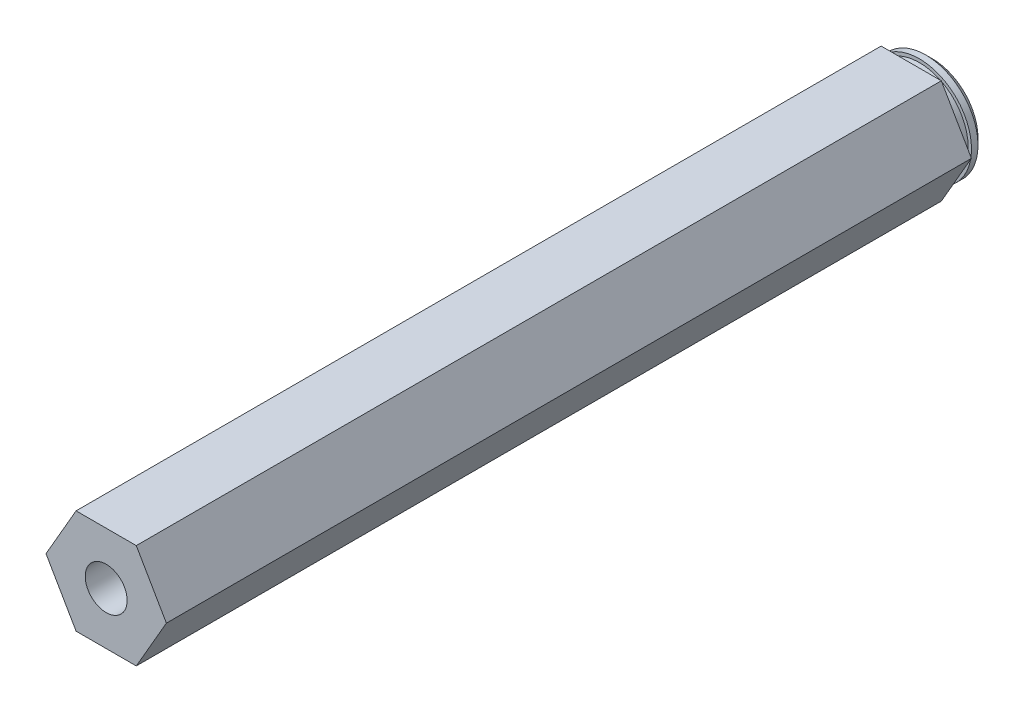
ISO-10303-21;
HEADER;
FILE_DESCRIPTION(('STEP AP214'),'2;1');
FILE_NAME('part.step','',(''),(''),'','','');
FILE_SCHEMA(('AUTOMOTIVE_DESIGN { 1 0 10303 214 1 1 1 1 }'));
ENDSEC;
DATA;
#1=APPLICATION_CONTEXT('core data for automotive mechanical design processes');
#2=APPLICATION_PROTOCOL_DEFINITION('international standard','automotive_design',2000,#1);
#3=PRODUCT_CONTEXT('',#1,'mechanical');
#4=PRODUCT('Part','Part','',(#3));
#5=PRODUCT_RELATED_PRODUCT_CATEGORY('part','',(#4));
#6=PRODUCT_DEFINITION_FORMATION('','',#4);
#7=PRODUCT_DEFINITION_CONTEXT('part definition',#1,'design');
#8=PRODUCT_DEFINITION('design','',#6,#7);
#9=PRODUCT_DEFINITION_SHAPE('','',#8);
#10=(LENGTH_UNIT() NAMED_UNIT(*) SI_UNIT(.MILLI.,.METRE.));
#11=(NAMED_UNIT(*) PLANE_ANGLE_UNIT() SI_UNIT($,.RADIAN.));
#12=(NAMED_UNIT(*) SI_UNIT($,.STERADIAN.) SOLID_ANGLE_UNIT());
#13=UNCERTAINTY_MEASURE_WITH_UNIT(LENGTH_MEASURE(1.E-05),#10,'distance_accuracy_value','');
#14=(GEOMETRIC_REPRESENTATION_CONTEXT(3) GLOBAL_UNCERTAINTY_ASSIGNED_CONTEXT((#13)) GLOBAL_UNIT_ASSIGNED_CONTEXT((#10,
#11,#12)) REPRESENTATION_CONTEXT('',''));
#15=CARTESIAN_POINT('',(0.,0.,0.));
#16=DIRECTION('',(0.,0.,1.));
#17=DIRECTION('',(1.,0.,0.));
#18=AXIS2_PLACEMENT_3D('',#15,#16,#17);
#19=CARTESIAN_POINT('',(0.,0.,-38.0999999999858));
#20=DIRECTION('',(0.,0.,-1.));
#21=DIRECTION('',(-1.,0.,0.));
#22=AXIS2_PLACEMENT_3D('',#19,#20,#21);
#23=CONICAL_SURFACE('',#22,3.1877000000122,1.02974425867476);
#24=CARTESIAN_POINT('',(0.,0.,-36.1846366047303));
#25=VERTEX_POINT('',#24);
#26=VERTEX_LOOP('',#25);
#27=FACE_BOUND('',#26,.T.);
#28=CARTESIAN_POINT('',(0.,0.,-38.0999999999997));
#29=DIRECTION('',(0.,0.,-1.));
#30=DIRECTION('',(-1.,0.,0.));
#31=AXIS2_PLACEMENT_3D('',#28,#29,#30);
#32=CIRCLE('',#31,3.1877);
#33=CARTESIAN_POINT('',(-3.18770000000004,0.,-38.0999999999997));
#34=VERTEX_POINT('',#33);
#35=EDGE_CURVE('E77',#34,#34,#32,.T.);
#36=ORIENTED_EDGE('',*,*,#35,.T.);
#37=EDGE_LOOP('',(#36));
#38=FACE_BOUND('',#37,.T.);
#39=ADVANCED_FACE('F17',(#27,#38),#23,.F.);
#40=CARTESIAN_POINT('',(0.,0.,-63.4999999999997));
#41=DIRECTION('',(0.,0.,-1.));
#42=DIRECTION('',(-1.,0.,0.));
#43=AXIS2_PLACEMENT_3D('',#40,#41,#42);
#44=CYLINDRICAL_SURFACE('',#43,3.1877);
#45=ORIENTED_EDGE('',*,*,#35,.F.);
#46=EDGE_LOOP('',(#45));
#47=FACE_BOUND('',#46,.T.);
#48=CARTESIAN_POINT('',(0.,0.,-63.4999999999997));
#49=DIRECTION('',(0.,0.,-1.));
#50=DIRECTION('',(-1.,0.,0.));
#51=AXIS2_PLACEMENT_3D('',#48,#49,#50);
#52=CIRCLE('',#51,3.1877);
#53=CARTESIAN_POINT('',(-3.18770000000004,0.,-63.4999999999997));
#54=VERTEX_POINT('',#53);
#55=EDGE_CURVE('E20',#54,#54,#52,.T.);
#56=ORIENTED_EDGE('',*,*,#55,.T.);
#57=EDGE_LOOP('',(#56));
#58=FACE_BOUND('',#57,.T.);
#59=ADVANCED_FACE('F74',(#47,#58),#44,.F.);
#60=CARTESIAN_POINT('',(0.,0.,-63.4999999999997));
#61=DIRECTION('',(0.,0.,1.));
#62=DIRECTION('',(1.,0.,0.));
#63=AXIS2_PLACEMENT_3D('',#60,#61,#62);
#64=PLANE('',#63);
#65=ORIENTED_EDGE('',*,*,#55,.F.);
#66=EDGE_LOOP('',(#65));
#67=FACE_BOUND('',#66,.T.);
#68=CARTESIAN_POINT('',(-1.11022302462516E-13,0.,-63.5000000000332));
#69=DIRECTION('',(0.,0.,1.));
#70=DIRECTION('',(1.,0.,0.));
#71=AXIS2_PLACEMENT_3D('',#68,#69,#70);
#72=CIRCLE('',#71,5.55624999998383);
#73=CARTESIAN_POINT('',(5.55624999998372,0.,-63.5000000000332));
#74=VERTEX_POINT('',#73);
#75=EDGE_CURVE('E81',#74,#74,#72,.T.);
#76=ORIENTED_EDGE('',*,*,#75,.F.);
#77=EDGE_LOOP('',(#76));
#78=FACE_BOUND('',#77,.T.);
#79=ADVANCED_FACE('F113',(#67,#78),#64,.F.);
#80=CARTESIAN_POINT('',(-1.11022302462516E-13,0.,-62.7062500000193));
#81=DIRECTION('',(0.,0.,1.));
#82=DIRECTION('',(1.,0.,0.));
#83=AXIS2_PLACEMENT_3D('',#80,#81,#82);
#84=CONICAL_SURFACE('',#83,6.34999999999775,0.785398163397448);
#85=CARTESIAN_POINT('',(0.,0.,-62.7062499999997));
#86=DIRECTION('',(0.,0.,-1.));
#87=DIRECTION('',(-1.,0.,0.));
#88=AXIS2_PLACEMENT_3D('',#85,#86,#87);
#89=CIRCLE('',#88,6.35000000000001);
#90=CARTESIAN_POINT('',(-6.35,0.,-62.7062499999997));
#91=VERTEX_POINT('',#90);
#92=EDGE_CURVE('E84',#91,#91,#89,.F.);
#93=ORIENTED_EDGE('',*,*,#92,.F.);
#94=EDGE_LOOP('',(#93));
#95=FACE_BOUND('',#94,.T.);
#96=ORIENTED_EDGE('',*,*,#75,.T.);
#97=EDGE_LOOP('',(#96));
#98=FACE_BOUND('',#97,.T.);
#99=ADVANCED_FACE('F111',(#95,#98),#84,.T.);
#100=CARTESIAN_POINT('',(0.,0.,-60.9218999999998));
#101=DIRECTION('',(0.,0.,-1.));
#102=DIRECTION('',(-1.,0.,0.));
#103=AXIS2_PLACEMENT_3D('',#100,#101,#102);
#104=CYLINDRICAL_SURFACE('',#103,6.35000000000001);
#105=ORIENTED_EDGE('',*,*,#92,.T.);
#106=EDGE_LOOP('',(#105));
#107=FACE_BOUND('',#106,.T.);
#108=CARTESIAN_POINT('',(0.,0.,-61.9124999999996));
#109=DIRECTION('',(0.,0.,-1.));
#110=DIRECTION('',(-1.,0.,0.));
#111=AXIS2_PLACEMENT_3D('',#108,#109,#110);
#112=CIRCLE('',#111,6.35000000000001);
#113=CARTESIAN_POINT('',(-6.35,0.,-61.9124999999996));
#114=VERTEX_POINT('',#113);
#115=EDGE_CURVE('E100',#114,#114,#112,.F.);
#116=ORIENTED_EDGE('',*,*,#115,.F.);
#117=EDGE_LOOP('',(#116));
#118=FACE_BOUND('',#117,.T.);
#119=ADVANCED_FACE('F108',(#107,#118),#104,.T.);
#120=CARTESIAN_POINT('',(0.,6.34999999999994,-61.9124999999997));
#121=DIRECTION('',(0.,0.,1.));
#122=DIRECTION('',(1.,0.,0.));
#123=AXIS2_PLACEMENT_3D('',#120,#121,#122);
#124=PLANE('',#123);
#125=CARTESIAN_POINT('',(0.,0.,-61.9124999999996));
#126=DIRECTION('',(0.,0.,1.));
#127=DIRECTION('',(1.,0.,0.));
#128=AXIS2_PLACEMENT_3D('',#125,#126,#127);
#129=CIRCLE('',#128,5.94360000000001);
#130=CARTESIAN_POINT('',(5.94360000000001,0.,-61.9124999999996));
#131=VERTEX_POINT('',#130);
#132=EDGE_CURVE('E96',#131,#131,#129,.T.);
#133=ORIENTED_EDGE('',*,*,#132,.F.);
#134=EDGE_LOOP('',(#133));
#135=FACE_BOUND('',#134,.T.);
#136=ORIENTED_EDGE('',*,*,#115,.T.);
#137=EDGE_LOOP('',(#136));
#138=FACE_BOUND('',#137,.T.);
#139=ADVANCED_FACE('F120',(#135,#138),#124,.T.);
#140=CARTESIAN_POINT('',(0.,0.,-5.68432771574923E-11));
#141=DIRECTION('',(0.,0.,1.));
#142=DIRECTION('',(1.,0.,0.));
#143=AXIS2_PLACEMENT_3D('',#140,#141,#142);
#144=CONICAL_SURFACE('',#143,2.55270000002383,1.02974425868774);
#145=CARTESIAN_POINT('',(0.,0.,-1.53381690222432));
#146=VERTEX_POINT('',#145);
#147=VERTEX_LOOP('',#146);
#148=FACE_BOUND('',#147,.T.);
#149=CARTESIAN_POINT('',(0.,0.,0.));
#150=DIRECTION('',(0.,0.,1.));
#151=DIRECTION('',(1.,0.,0.));
#152=AXIS2_PLACEMENT_3D('',#149,#150,#151);
#153=CIRCLE('',#152,2.5527);
#154=CARTESIAN_POINT('',(2.55269999999995,0.,0.));
#155=VERTEX_POINT('',#154);
#156=EDGE_CURVE('E99',#155,#155,#153,.T.);
#157=ORIENTED_EDGE('',*,*,#156,.T.);
#158=EDGE_LOOP('',(#157));
#159=FACE_BOUND('',#158,.T.);
#160=ADVANCED_FACE('F166',(#148,#159),#144,.F.);
#161=CARTESIAN_POINT('',(0.,0.,0.));
#162=DIRECTION('',(0.,0.,1.));
#163=DIRECTION('',(1.,0.,0.));
#164=AXIS2_PLACEMENT_3D('',#161,#162,#163);
#165=CYLINDRICAL_SURFACE('',#164,5.94360000000001);
#166=ORIENTED_EDGE('',*,*,#132,.T.);
#167=EDGE_LOOP('',(#166));
#168=FACE_BOUND('',#167,.T.);
#169=CARTESIAN_POINT('',(0.,0.,-60.9218999999998));
#170=DIRECTION('',(0.,0.,1.));
#171=DIRECTION('',(1.,0.,0.));
#172=AXIS2_PLACEMENT_3D('',#169,#170,#171);
#173=CIRCLE('',#172,5.94360000000001);
#174=CARTESIAN_POINT('',(5.94360000000001,0.,-60.9218999999998));
#175=VERTEX_POINT('',#174);
#176=EDGE_CURVE('E91',#175,#175,#173,.T.);
#177=ORIENTED_EDGE('',*,*,#176,.F.);
#178=EDGE_LOOP('',(#177));
#179=FACE_BOUND('',#178,.T.);
#180=ADVANCED_FACE('F162',(#168,#179),#165,.T.);
#181=CARTESIAN_POINT('',(0.,0.,63.5000000000003));
#182=DIRECTION('',(0.,0.,1.));
#183=DIRECTION('',(1.,0.,0.));
#184=AXIS2_PLACEMENT_3D('',#181,#182,#183);
#185=CYLINDRICAL_SURFACE('',#184,2.5527);
#186=ORIENTED_EDGE('',*,*,#156,.F.);
#187=EDGE_LOOP('',(#186));
#188=FACE_BOUND('',#187,.T.);
#189=CARTESIAN_POINT('',(0.,0.,37.1538500000003));
#190=DIRECTION('',(0.,0.,1.));
#191=DIRECTION('',(1.,0.,0.));
#192=AXIS2_PLACEMENT_3D('',#189,#190,#191);
#193=CIRCLE('',#192,2.5527);
#194=CARTESIAN_POINT('',(2.55269999999995,0.,37.1538500000003));
#195=VERTEX_POINT('',#194);
#196=EDGE_CURVE('E86',#195,#195,#193,.F.);
#197=ORIENTED_EDGE('',*,*,#196,.F.);
#198=EDGE_LOOP('',(#197));
#199=FACE_BOUND('',#198,.T.);
#200=ADVANCED_FACE('F158',(#188,#199),#185,.F.);
#201=CARTESIAN_POINT('',(3.666174209354,-6.35000000000019,63.5000000000003));
#202=DIRECTION('',(-0.866025403784439,0.5,0.));
#203=DIRECTION('',(-0.5,-0.866025403784439,0.));
#204=AXIS2_PLACEMENT_3D('',#201,#202,#203);
#205=PLANE('',#204);
#206=DIRECTION('',(0.,0.,1.));
#207=VECTOR('',#206,1.);
#208=CARTESIAN_POINT('',(3.66617420935406,-6.35000000000005,63.5000000000004));
#209=LINE('',#208,#207);
#210=CARTESIAN_POINT('',(3.66617420935407,-6.35000000000006,37.1538500000003));
#211=VERTEX_POINT('',#210);
#212=CARTESIAN_POINT('',(3.66617420935408,-6.35000000000007,-60.9218999999997));
#213=VERTEX_POINT('',#212);
#214=EDGE_CURVE('E213',#211,#213,#209,.F.);
#215=ORIENTED_EDGE('',*,*,#214,.T.);
#216=DIRECTION('',(-0.499999999999999,-0.866025403784439,0.));
#217=VECTOR('',#216,1.);
#218=CARTESIAN_POINT('',(7.33234841870817,0.,-60.9218999999998));
#219=LINE('',#218,#217);
#220=CARTESIAN_POINT('',(7.33234841870823,0.,-60.9218999999998));
#221=VERTEX_POINT('',#220);
#222=EDGE_CURVE('E206',#221,#213,#219,.T.);
#223=ORIENTED_EDGE('',*,*,#222,.F.);
#224=DIRECTION('',(0.,0.,1.));
#225=VECTOR('',#224,1.);
#226=CARTESIAN_POINT('',(7.33234841870826,0.,63.5000000000003));
#227=LINE('',#226,#225);
#228=CARTESIAN_POINT('',(7.33234841870823,0.,37.1538500000003));
#229=VERTEX_POINT('',#228);
#230=EDGE_CURVE('E219',#221,#229,#227,.T.);
#231=ORIENTED_EDGE('',*,*,#230,.T.);
#232=DIRECTION('',(0.500000000000011,0.866025403784432,0.));
#233=VECTOR('',#232,1.);
#234=CARTESIAN_POINT('',(3.66617420935406,-6.35000000000005,37.1538500000003));
#235=LINE('',#234,#233);
#236=EDGE_CURVE('E89',#211,#229,#235,.T.);
#237=ORIENTED_EDGE('',*,*,#236,.F.);
#238=EDGE_LOOP('',(#215,#223,#231,#237));
#239=FACE_BOUND('',#238,.T.);
#240=ADVANCED_FACE('F154',(#239),#205,.F.);
#241=CARTESIAN_POINT('',(7.33234841870831,0.,63.5000000000003));
#242=DIRECTION('',(-0.866025403784439,-0.5,0.));
#243=DIRECTION('',(0.5,-0.866025403784439,0.));
#244=AXIS2_PLACEMENT_3D('',#241,#242,#243);
#245=PLANE('',#244);
#246=ORIENTED_EDGE('',*,*,#230,.F.);
#247=DIRECTION('',(0.499999999999994,-0.866025403784442,0.));
#248=VECTOR('',#247,1.);
#249=CARTESIAN_POINT('',(3.66617420935406,6.35000000000002,-60.9218999999998));
#250=LINE('',#249,#248);
#251=CARTESIAN_POINT('',(3.6661742093541,6.34999999999998,-60.9218999999998));
#252=VERTEX_POINT('',#251);
#253=EDGE_CURVE('E208',#252,#221,#250,.T.);
#254=ORIENTED_EDGE('',*,*,#253,.F.);
#255=DIRECTION('',(0.,0.,1.));
#256=VECTOR('',#255,1.);
#257=CARTESIAN_POINT('',(3.66617420935406,6.34999999999999,63.5000000000003));
#258=LINE('',#257,#256);
#259=CARTESIAN_POINT('',(3.66617420935411,6.34999999999999,37.1538500000002));
#260=VERTEX_POINT('',#259);
#261=EDGE_CURVE('E216',#252,#260,#258,.T.);
#262=ORIENTED_EDGE('',*,*,#261,.T.);
#263=DIRECTION('',(-0.499999999999998,0.866025403784439,0.));
#264=VECTOR('',#263,1.);
#265=CARTESIAN_POINT('',(7.33234841870825,-1.11022302462516E-13,37.1538500000003));
#266=LINE('',#265,#264);
#267=EDGE_CURVE('E199',#229,#260,#266,.T.);
#268=ORIENTED_EDGE('',*,*,#267,.F.);
#269=EDGE_LOOP('',(#246,#254,#262,#268));
#270=FACE_BOUND('',#269,.T.);
#271=ADVANCED_FACE('F150',(#270),#245,.F.);
#272=CARTESIAN_POINT('',(3.66617420935403,6.34999999999999,63.5000000000003));
#273=DIRECTION('',(0.,-1.,0.));
#274=DIRECTION('',(1.,0.,0.));
#275=AXIS2_PLACEMENT_3D('',#272,#273,#274);
#276=PLANE('',#275);
#277=ORIENTED_EDGE('',*,*,#261,.F.);
#278=DIRECTION('',(-1.,0.,0.));
#279=VECTOR('',#278,1.);
#280=CARTESIAN_POINT('',(0.,6.34999999999991,-60.9218999999998));
#281=LINE('',#280,#279);
#282=CARTESIAN_POINT('',(-3.66617420935422,6.34999999999994,-60.9218999999998));
#283=VERTEX_POINT('',#282);
#284=EDGE_CURVE('E211',#283,#252,#281,.F.);
#285=ORIENTED_EDGE('',*,*,#284,.F.);
#286=DIRECTION('',(0.,0.,1.));
#287=VECTOR('',#286,1.);
#288=CARTESIAN_POINT('',(-3.66617420935429,6.34999999999996,63.5000000000004));
#289=LINE('',#288,#287);
#290=CARTESIAN_POINT('',(-3.66617420935422,6.34999999999998,37.1538500000003));
#291=VERTEX_POINT('',#290);
#292=EDGE_CURVE('E90',#283,#291,#289,.T.);
#293=ORIENTED_EDGE('',*,*,#292,.T.);
#294=DIRECTION('',(1.,0.,0.));
#295=VECTOR('',#294,1.);
#296=CARTESIAN_POINT('',(0.,6.34999999999997,37.1538500000003));
#297=LINE('',#296,#295);
#298=EDGE_CURVE('E197',#260,#291,#297,.F.);
#299=ORIENTED_EDGE('',*,*,#298,.F.);
#300=EDGE_LOOP('',(#277,#285,#293,#299));
#301=FACE_BOUND('',#300,.T.);
#302=ADVANCED_FACE('F146',(#301),#276,.F.);
#303=CARTESIAN_POINT('',(-3.66617420935421,-6.35000000000005,63.5000000000004));
#304=DIRECTION('',(0.,1.,0.));
#305=DIRECTION('',(-1.,0.,0.));
#306=AXIS2_PLACEMENT_3D('',#303,#304,#305);
#307=PLANE('',#306);
#308=DIRECTION('',(0.,0.,1.));
#309=VECTOR('',#308,1.);
#310=CARTESIAN_POINT('',(-3.66617420935415,-6.35000000000003,63.5000000000003));
#311=LINE('',#310,#309);
#312=CARTESIAN_POINT('',(-3.66617420935417,-6.35000000000005,37.1538500000002));
#313=VERTEX_POINT('',#312);
#314=CARTESIAN_POINT('',(-3.66617420935417,-6.35000000000007,-60.9218999999997));
#315=VERTEX_POINT('',#314);
#316=EDGE_CURVE('E187',#313,#315,#311,.F.);
#317=ORIENTED_EDGE('',*,*,#316,.T.);
#318=DIRECTION('',(-1.,0.,0.));
#319=VECTOR('',#318,1.);
#320=CARTESIAN_POINT('',(0.,-6.35000000000005,-60.9218999999998));
#321=LINE('',#320,#319);
#322=EDGE_CURVE('E95',#213,#315,#321,.T.);
#323=ORIENTED_EDGE('',*,*,#322,.F.);
#324=ORIENTED_EDGE('',*,*,#214,.F.);
#325=DIRECTION('',(1.,0.,0.));
#326=VECTOR('',#325,1.);
#327=CARTESIAN_POINT('',(0.,-6.35000000000005,37.1538500000003));
#328=LINE('',#327,#326);
#329=EDGE_CURVE('E191',#313,#211,#328,.T.);
#330=ORIENTED_EDGE('',*,*,#329,.F.);
#331=EDGE_LOOP('',(#317,#323,#324,#330));
#332=FACE_BOUND('',#331,.T.);
#333=ADVANCED_FACE('F142',(#332),#307,.F.);
#334=CARTESIAN_POINT('',(0.,0.,-60.9218999999998));
#335=DIRECTION('',(0.,0.,-1.));
#336=DIRECTION('',(-1.,0.,0.));
#337=AXIS2_PLACEMENT_3D('',#334,#335,#336);
#338=PLANE('',#337);
#339=ORIENTED_EDGE('',*,*,#176,.T.);
#340=EDGE_LOOP('',(#339));
#341=FACE_BOUND('',#340,.T.);
#342=DIRECTION('',(-0.5,0.866025403784438,0.));
#343=VECTOR('',#342,1.);
#344=CARTESIAN_POINT('',(-7.33234841870829,0.,-60.9218999999996));
#345=LINE('',#344,#343);
#346=CARTESIAN_POINT('',(-7.33234841870831,0.,-60.9218999999997));
#347=VERTEX_POINT('',#346);
#348=EDGE_CURVE('E183',#315,#347,#345,.T.);
#349=ORIENTED_EDGE('',*,*,#348,.T.);
#350=DIRECTION('',(0.499999999999999,0.866025403784439,0.));
#351=VECTOR('',#350,1.);
#352=CARTESIAN_POINT('',(-3.66617420935422,6.35000000000004,-60.9218999999997));
#353=LINE('',#352,#351);
#354=EDGE_CURVE('E94',#347,#283,#353,.T.);
#355=ORIENTED_EDGE('',*,*,#354,.T.);
#356=ORIENTED_EDGE('',*,*,#284,.T.);
#357=ORIENTED_EDGE('',*,*,#253,.T.);
#358=ORIENTED_EDGE('',*,*,#222,.T.);
#359=ORIENTED_EDGE('',*,*,#322,.T.);
#360=EDGE_LOOP('',(#349,#355,#356,#357,#358,#359));
#361=FACE_BOUND('',#360,.T.);
#362=ADVANCED_FACE('F138',(#341,#361),#338,.T.);
#363=CARTESIAN_POINT('',(-3.66617420935424,6.35000000000005,63.5000000000004));
#364=DIRECTION('',(0.866025403784439,-0.499999999999999,0.));
#365=DIRECTION('',(0.499999999999999,0.866025403784439,0.));
#366=AXIS2_PLACEMENT_3D('',#363,#364,#365);
#367=PLANE('',#366);
#368=ORIENTED_EDGE('',*,*,#292,.F.);
#369=ORIENTED_EDGE('',*,*,#354,.F.);
#370=DIRECTION('',(0.,0.,1.));
#371=VECTOR('',#370,1.);
#372=CARTESIAN_POINT('',(-7.33234841870831,0.,63.5000000000003));
#373=LINE('',#372,#371);
#374=CARTESIAN_POINT('',(-7.33234841870833,0.,37.1538500000004));
#375=VERTEX_POINT('',#374);
#376=EDGE_CURVE('E26',#347,#375,#373,.T.);
#377=ORIENTED_EDGE('',*,*,#376,.T.);
#378=DIRECTION('',(-0.499999999999997,-0.86602540378444,0.));
#379=VECTOR('',#378,1.);
#380=CARTESIAN_POINT('',(-3.66617420935418,6.35000000000008,37.1538500000003));
#381=LINE('',#380,#379);
#382=EDGE_CURVE('E34',#291,#375,#381,.T.);
#383=ORIENTED_EDGE('',*,*,#382,.F.);
#384=EDGE_LOOP('',(#368,#369,#377,#383));
#385=FACE_BOUND('',#384,.T.);
#386=ADVANCED_FACE('F132',(#385),#367,.F.);
#387=CARTESIAN_POINT('',(0.,0.,37.1538500000003));
#388=DIRECTION('',(0.,0.,1.));
#389=DIRECTION('',(1.,0.,0.));
#390=AXIS2_PLACEMENT_3D('',#387,#388,#389);
#391=PLANE('',#390);
#392=DIRECTION('',(-0.5,0.866025403784438,0.));
#393=VECTOR('',#392,1.);
#394=CARTESIAN_POINT('',(-7.33234841870828,0.,37.1538500000004));
#395=LINE('',#394,#393);
#396=EDGE_CURVE('E11',#375,#313,#395,.F.);
#397=ORIENTED_EDGE('',*,*,#396,.T.);
#398=ORIENTED_EDGE('',*,*,#329,.T.);
#399=ORIENTED_EDGE('',*,*,#236,.T.);
#400=ORIENTED_EDGE('',*,*,#267,.T.);
#401=ORIENTED_EDGE('',*,*,#298,.T.);
#402=ORIENTED_EDGE('',*,*,#382,.T.);
#403=EDGE_LOOP('',(#397,#398,#399,#400,#401,#402));
#404=FACE_BOUND('',#403,.T.);
#405=ORIENTED_EDGE('',*,*,#196,.T.);
#406=EDGE_LOOP('',(#405));
#407=FACE_BOUND('',#406,.T.);
#408=ADVANCED_FACE('F126',(#404,#407),#391,.T.);
#409=CARTESIAN_POINT('',(-7.33234841870828,0.,63.5000000000003));
#410=DIRECTION('',(0.866025403784438,0.5,0.));
#411=DIRECTION('',(-0.5,0.866025403784438,0.));
#412=AXIS2_PLACEMENT_3D('',#409,#410,#411);
#413=PLANE('',#412);
#414=ORIENTED_EDGE('',*,*,#376,.F.);
#415=ORIENTED_EDGE('',*,*,#348,.F.);
#416=ORIENTED_EDGE('',*,*,#316,.F.);
#417=ORIENTED_EDGE('',*,*,#396,.F.);
#418=EDGE_LOOP('',(#414,#415,#416,#417));
#419=FACE_BOUND('',#418,.T.);
#420=ADVANCED_FACE('F124',(#419),#413,.F.);
#421=CLOSED_SHELL('',(#39,#59,#79,#99,#119,#139,#160,#180,#200,#240,#271,#302,#333,#362,#386,
#408,#420));
#422=MANIFOLD_SOLID_BREP('B1',#421);
#423=ADVANCED_BREP_SHAPE_REPRESENTATION('',(#18,#422),#14);
#424=SHAPE_DEFINITION_REPRESENTATION(#9,#423);
ENDSEC;
END-ISO-10303-21;
